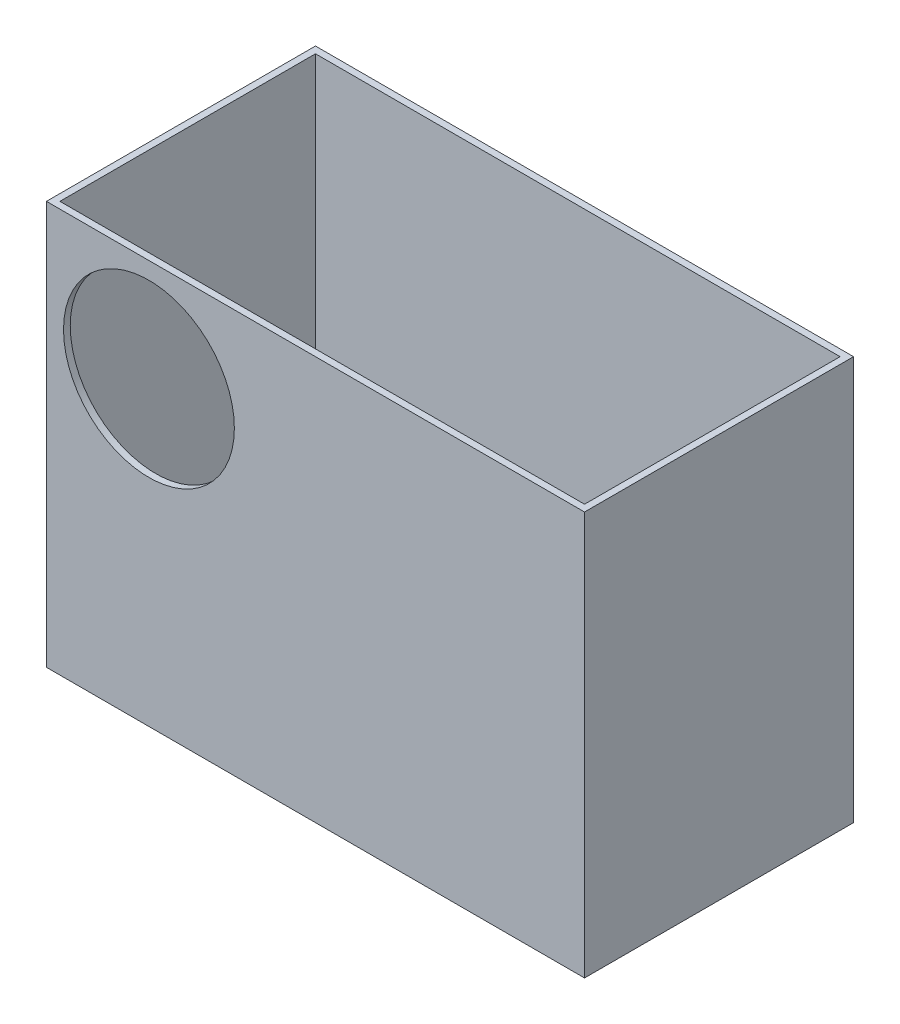
ISO-10303-21;
HEADER;
FILE_DESCRIPTION(('STEP AP214'),'2;1');
FILE_NAME('part.step','',(''),(''),'','','');
FILE_SCHEMA(('AUTOMOTIVE_DESIGN { 1 0 10303 214 1 1 1 1 }'));
ENDSEC;
DATA;
#1=APPLICATION_CONTEXT('core data for automotive mechanical design processes');
#2=APPLICATION_PROTOCOL_DEFINITION('international standard','automotive_design',2000,#1);
#3=PRODUCT_CONTEXT('',#1,'mechanical');
#4=PRODUCT('Part','Part','',(#3));
#5=PRODUCT_RELATED_PRODUCT_CATEGORY('part','',(#4));
#6=PRODUCT_DEFINITION_FORMATION('','',#4);
#7=PRODUCT_DEFINITION_CONTEXT('part definition',#1,'design');
#8=PRODUCT_DEFINITION('design','',#6,#7);
#9=PRODUCT_DEFINITION_SHAPE('','',#8);
#10=(LENGTH_UNIT() NAMED_UNIT(*) SI_UNIT(.MILLI.,.METRE.));
#11=(NAMED_UNIT(*) PLANE_ANGLE_UNIT() SI_UNIT($,.RADIAN.));
#12=(NAMED_UNIT(*) SI_UNIT($,.STERADIAN.) SOLID_ANGLE_UNIT());
#13=UNCERTAINTY_MEASURE_WITH_UNIT(LENGTH_MEASURE(1.E-05),#10,'distance_accuracy_value','');
#14=(GEOMETRIC_REPRESENTATION_CONTEXT(3) GLOBAL_UNCERTAINTY_ASSIGNED_CONTEXT((#13)) GLOBAL_UNIT_ASSIGNED_CONTEXT((#10,
#11,#12)) REPRESENTATION_CONTEXT('',''));
#15=CARTESIAN_POINT('',(0.,0.,0.));
#16=DIRECTION('',(0.,0.,1.));
#17=DIRECTION('',(1.,0.,0.));
#18=AXIS2_PLACEMENT_3D('',#15,#16,#17);
#19=CARTESIAN_POINT('',(0.,300.,0.));
#20=DIRECTION('',(0.,-1.,0.));
#21=DIRECTION('',(0.,0.,-1.));
#22=AXIS2_PLACEMENT_3D('',#19,#20,#21);
#23=PLANE('',#22);
#24=DIRECTION('',(0.,0.,-1.));
#25=VECTOR('',#24,1.);
#26=CARTESIAN_POINT('',(200.000000000001,300.,99.9999999999999));
#27=LINE('',#26,#25);
#28=CARTESIAN_POINT('',(200.000000000001,300.,99.9999999999999));
#29=VERTEX_POINT('',#28);
#30=CARTESIAN_POINT('',(200.000000000001,300.,-100.));
#31=VERTEX_POINT('',#30);
#32=EDGE_CURVE('E146',#29,#31,#27,.T.);
#33=ORIENTED_EDGE('',*,*,#32,.T.);
#34=DIRECTION('',(-1.,0.,0.));
#35=VECTOR('',#34,1.);
#36=CARTESIAN_POINT('',(-199.999999999999,300.,-100.));
#37=LINE('',#36,#35);
#38=CARTESIAN_POINT('',(-199.999999999999,300.,-100.));
#39=VERTEX_POINT('',#38);
#40=EDGE_CURVE('E149',#31,#39,#37,.T.);
#41=ORIENTED_EDGE('',*,*,#40,.T.);
#42=DIRECTION('',(0.,0.,1.));
#43=VECTOR('',#42,1.);
#44=CARTESIAN_POINT('',(-199.999999999999,300.,99.9999999999999));
#45=LINE('',#44,#43);
#46=CARTESIAN_POINT('',(-199.999999999999,300.,99.9999999999999));
#47=VERTEX_POINT('',#46);
#48=EDGE_CURVE('E152',#39,#47,#45,.T.);
#49=ORIENTED_EDGE('',*,*,#48,.T.);
#50=DIRECTION('',(1.,0.,0.));
#51=VECTOR('',#50,1.);
#52=CARTESIAN_POINT('',(-199.999999999999,300.,99.9999999999999));
#53=LINE('',#52,#51);
#54=EDGE_CURVE('E154',#47,#29,#53,.T.);
#55=ORIENTED_EDGE('',*,*,#54,.T.);
#56=EDGE_LOOP('',(#33,#41,#49,#55));
#57=FACE_BOUND('',#56,.T.);
#58=DIRECTION('',(0.,0.,-1.));
#59=VECTOR('',#58,1.);
#60=CARTESIAN_POINT('',(195.,300.,94.9999999999999));
#61=LINE('',#60,#59);
#62=CARTESIAN_POINT('',(195.,300.,94.9999999999999));
#63=VERTEX_POINT('',#62);
#64=CARTESIAN_POINT('',(195.,300.,-94.9999999999999));
#65=VERTEX_POINT('',#64);
#66=EDGE_CURVE('E131',#63,#65,#61,.T.);
#67=ORIENTED_EDGE('',*,*,#66,.F.);
#68=DIRECTION('',(1.,0.,0.));
#69=VECTOR('',#68,1.);
#70=CARTESIAN_POINT('',(-195.,300.,94.9999999999999));
#71=LINE('',#70,#69);
#72=CARTESIAN_POINT('',(-195.,300.,94.9999999999999));
#73=VERTEX_POINT('',#72);
#74=EDGE_CURVE('E112',#73,#63,#71,.T.);
#75=ORIENTED_EDGE('',*,*,#74,.F.);
#76=DIRECTION('',(0.,0.,1.));
#77=VECTOR('',#76,1.);
#78=CARTESIAN_POINT('',(-195.,300.,94.9999999999999));
#79=LINE('',#78,#77);
#80=CARTESIAN_POINT('',(-195.,300.,-94.9999999999999));
#81=VERTEX_POINT('',#80);
#82=EDGE_CURVE('E137',#81,#73,#79,.T.);
#83=ORIENTED_EDGE('',*,*,#82,.F.);
#84=DIRECTION('',(-1.,0.,0.));
#85=VECTOR('',#84,1.);
#86=CARTESIAN_POINT('',(-195.,300.,-94.9999999999999));
#87=LINE('',#86,#85);
#88=EDGE_CURVE('E135',#65,#81,#87,.T.);
#89=ORIENTED_EDGE('',*,*,#88,.F.);
#90=EDGE_LOOP('',(#67,#75,#83,#89));
#91=FACE_BOUND('',#90,.T.);
#92=ADVANCED_FACE('F40',(#57,#91),#23,.F.);
#93=CARTESIAN_POINT('',(0.,0.,0.));
#94=DIRECTION('',(0.,-1.,0.));
#95=DIRECTION('',(0.,0.,-1.));
#96=AXIS2_PLACEMENT_3D('',#93,#94,#95);
#97=PLANE('',#96);
#98=DIRECTION('',(0.,0.,-1.));
#99=VECTOR('',#98,1.);
#100=CARTESIAN_POINT('',(200.000000000001,0.,99.9999999999999));
#101=LINE('',#100,#99);
#102=CARTESIAN_POINT('',(200.000000000001,0.,99.9999999999999));
#103=VERTEX_POINT('',#102);
#104=CARTESIAN_POINT('',(200.000000000001,0.,-100.));
#105=VERTEX_POINT('',#104);
#106=EDGE_CURVE('E145',#103,#105,#101,.T.);
#107=ORIENTED_EDGE('',*,*,#106,.F.);
#108=DIRECTION('',(1.,0.,0.));
#109=VECTOR('',#108,1.);
#110=CARTESIAN_POINT('',(-199.999999999999,0.,99.9999999999999));
#111=LINE('',#110,#109);
#112=CARTESIAN_POINT('',(-199.999999999999,0.,99.9999999999999));
#113=VERTEX_POINT('',#112);
#114=EDGE_CURVE('E150',#113,#103,#111,.T.);
#115=ORIENTED_EDGE('',*,*,#114,.F.);
#116=DIRECTION('',(0.,0.,1.));
#117=VECTOR('',#116,1.);
#118=CARTESIAN_POINT('',(-199.999999999999,0.,99.9999999999999));
#119=LINE('',#118,#117);
#120=CARTESIAN_POINT('',(-199.999999999999,0.,-100.));
#121=VERTEX_POINT('',#120);
#122=EDGE_CURVE('E162',#121,#113,#119,.T.);
#123=ORIENTED_EDGE('',*,*,#122,.F.);
#124=DIRECTION('',(-1.,0.,0.));
#125=VECTOR('',#124,1.);
#126=CARTESIAN_POINT('',(-199.999999999999,0.,-100.));
#127=LINE('',#126,#125);
#128=EDGE_CURVE('E159',#105,#121,#127,.T.);
#129=ORIENTED_EDGE('',*,*,#128,.F.);
#130=EDGE_LOOP('',(#107,#115,#123,#129));
#131=FACE_BOUND('',#130,.T.);
#132=ADVANCED_FACE('F181',(#131),#97,.T.);
#133=CARTESIAN_POINT('',(200.000000000001,300.,99.9999999999999));
#134=DIRECTION('',(-1.,0.,0.));
#135=DIRECTION('',(0.,0.,1.));
#136=AXIS2_PLACEMENT_3D('',#133,#134,#135);
#137=PLANE('',#136);
#138=DIRECTION('',(0.,-1.,0.));
#139=VECTOR('',#138,1.);
#140=CARTESIAN_POINT('',(200.000000000001,300.,99.9999999999999));
#141=LINE('',#140,#139);
#142=EDGE_CURVE('E156',#29,#103,#141,.T.);
#143=ORIENTED_EDGE('',*,*,#142,.T.);
#144=ORIENTED_EDGE('',*,*,#106,.T.);
#145=DIRECTION('',(0.,-1.,0.));
#146=VECTOR('',#145,1.);
#147=CARTESIAN_POINT('',(200.000000000001,300.,-100.));
#148=LINE('',#147,#146);
#149=EDGE_CURVE('E48',#31,#105,#148,.T.);
#150=ORIENTED_EDGE('',*,*,#149,.F.);
#151=ORIENTED_EDGE('',*,*,#32,.F.);
#152=EDGE_LOOP('',(#143,#144,#150,#151));
#153=FACE_BOUND('',#152,.T.);
#154=ADVANCED_FACE('F42',(#153),#137,.F.);
#155=CARTESIAN_POINT('',(-199.999999999999,300.,-100.));
#156=DIRECTION('',(0.,0.,1.));
#157=DIRECTION('',(1.,0.,0.));
#158=AXIS2_PLACEMENT_3D('',#155,#156,#157);
#159=PLANE('',#158);
#160=ORIENTED_EDGE('',*,*,#149,.T.);
#161=ORIENTED_EDGE('',*,*,#128,.T.);
#162=DIRECTION('',(0.,-1.,0.));
#163=VECTOR('',#162,1.);
#164=CARTESIAN_POINT('',(-199.999999999999,300.,-100.));
#165=LINE('',#164,#163);
#166=EDGE_CURVE('E170',#39,#121,#165,.T.);
#167=ORIENTED_EDGE('',*,*,#166,.F.);
#168=ORIENTED_EDGE('',*,*,#40,.F.);
#169=EDGE_LOOP('',(#160,#161,#167,#168));
#170=FACE_BOUND('',#169,.T.);
#171=ADVANCED_FACE('F174',(#170),#159,.F.);
#172=CARTESIAN_POINT('',(-199.999999999999,300.,99.9999999999999));
#173=DIRECTION('',(1.,0.,0.));
#174=DIRECTION('',(0.,0.,-1.));
#175=AXIS2_PLACEMENT_3D('',#172,#173,#174);
#176=PLANE('',#175);
#177=ORIENTED_EDGE('',*,*,#166,.T.);
#178=ORIENTED_EDGE('',*,*,#122,.T.);
#179=DIRECTION('',(0.,-1.,0.));
#180=VECTOR('',#179,1.);
#181=CARTESIAN_POINT('',(-199.999999999999,300.,99.9999999999999));
#182=LINE('',#181,#180);
#183=EDGE_CURVE('E168',#47,#113,#182,.T.);
#184=ORIENTED_EDGE('',*,*,#183,.F.);
#185=ORIENTED_EDGE('',*,*,#48,.F.);
#186=EDGE_LOOP('',(#177,#178,#184,#185));
#187=FACE_BOUND('',#186,.T.);
#188=ADVANCED_FACE('F190',(#187),#176,.F.);
#189=CARTESIAN_POINT('',(-199.999999999999,300.,99.9999999999999));
#190=DIRECTION('',(0.,0.,-1.));
#191=DIRECTION('',(-1.,0.,0.));
#192=AXIS2_PLACEMENT_3D('',#189,#190,#191);
#193=PLANE('',#192);
#194=CARTESIAN_POINT('',(-123.799999999999,223.8,99.9999999999999));
#195=DIRECTION('',(0.,0.,1.));
#196=DIRECTION('',(1.,0.,0.));
#197=AXIS2_PLACEMENT_3D('',#194,#195,#196);
#198=CIRCLE('',#197,63.5);
#199=CARTESIAN_POINT('',(-60.2999999999988,223.8,99.9999999999999));
#200=VERTEX_POINT('',#199);
#201=EDGE_CURVE('E128',#200,#200,#198,.T.);
#202=ORIENTED_EDGE('',*,*,#201,.F.);
#203=EDGE_LOOP('',(#202));
#204=FACE_BOUND('',#203,.T.);
#205=ORIENTED_EDGE('',*,*,#183,.T.);
#206=ORIENTED_EDGE('',*,*,#114,.T.);
#207=ORIENTED_EDGE('',*,*,#142,.F.);
#208=ORIENTED_EDGE('',*,*,#54,.F.);
#209=EDGE_LOOP('',(#205,#206,#207,#208));
#210=FACE_BOUND('',#209,.T.);
#211=ADVANCED_FACE('F186',(#204,#210),#193,.F.);
#212=CARTESIAN_POINT('',(195.,300.,94.9999999999999));
#213=DIRECTION('',(-1.,0.,0.));
#214=DIRECTION('',(0.,0.,1.));
#215=AXIS2_PLACEMENT_3D('',#212,#213,#214);
#216=PLANE('',#215);
#217=DIRECTION('',(0.,0.,-1.));
#218=VECTOR('',#217,1.);
#219=CARTESIAN_POINT('',(195.,0.5,94.9999999999999));
#220=LINE('',#219,#218);
#221=CARTESIAN_POINT('',(195.,0.5,94.9999999999999));
#222=VERTEX_POINT('',#221);
#223=CARTESIAN_POINT('',(195.,0.5,-94.9999999999999));
#224=VERTEX_POINT('',#223);
#225=EDGE_CURVE('E118',#222,#224,#220,.T.);
#226=ORIENTED_EDGE('',*,*,#225,.F.);
#227=DIRECTION('',(0.,-1.,0.));
#228=VECTOR('',#227,1.);
#229=CARTESIAN_POINT('',(195.,300.,94.9999999999999));
#230=LINE('',#229,#228);
#231=EDGE_CURVE('E107',#63,#222,#230,.T.);
#232=ORIENTED_EDGE('',*,*,#231,.F.);
#233=ORIENTED_EDGE('',*,*,#66,.T.);
#234=DIRECTION('',(0.,-1.,0.));
#235=VECTOR('',#234,1.);
#236=CARTESIAN_POINT('',(195.,300.,-94.9999999999999));
#237=LINE('',#236,#235);
#238=EDGE_CURVE('E120',#65,#224,#237,.T.);
#239=ORIENTED_EDGE('',*,*,#238,.T.);
#240=EDGE_LOOP('',(#226,#232,#233,#239));
#241=FACE_BOUND('',#240,.T.);
#242=ADVANCED_FACE('F119',(#241),#216,.T.);
#243=CARTESIAN_POINT('',(-195.,300.,-94.9999999999999));
#244=DIRECTION('',(0.,0.,1.));
#245=DIRECTION('',(1.,0.,0.));
#246=AXIS2_PLACEMENT_3D('',#243,#244,#245);
#247=PLANE('',#246);
#248=DIRECTION('',(-1.,0.,0.));
#249=VECTOR('',#248,1.);
#250=CARTESIAN_POINT('',(-195.,0.5,-94.9999999999999));
#251=LINE('',#250,#249);
#252=CARTESIAN_POINT('',(-195.,0.5,-94.9999999999999));
#253=VERTEX_POINT('',#252);
#254=EDGE_CURVE('E55',#224,#253,#251,.T.);
#255=ORIENTED_EDGE('',*,*,#254,.F.);
#256=ORIENTED_EDGE('',*,*,#238,.F.);
#257=ORIENTED_EDGE('',*,*,#88,.T.);
#258=DIRECTION('',(0.,-1.,0.));
#259=VECTOR('',#258,1.);
#260=CARTESIAN_POINT('',(-195.,300.,-94.9999999999999));
#261=LINE('',#260,#259);
#262=EDGE_CURVE('E142',#81,#253,#261,.T.);
#263=ORIENTED_EDGE('',*,*,#262,.T.);
#264=EDGE_LOOP('',(#255,#256,#257,#263));
#265=FACE_BOUND('',#264,.T.);
#266=ADVANCED_FACE('F197',(#265),#247,.T.);
#267=CARTESIAN_POINT('',(-195.,300.,94.9999999999999));
#268=DIRECTION('',(1.,0.,0.));
#269=DIRECTION('',(0.,0.,-1.));
#270=AXIS2_PLACEMENT_3D('',#267,#268,#269);
#271=PLANE('',#270);
#272=DIRECTION('',(0.,0.,1.));
#273=VECTOR('',#272,1.);
#274=CARTESIAN_POINT('',(-195.,0.5,94.9999999999999));
#275=LINE('',#274,#273);
#276=CARTESIAN_POINT('',(-195.,0.5,94.9999999999999));
#277=VERTEX_POINT('',#276);
#278=EDGE_CURVE('E63',#253,#277,#275,.T.);
#279=ORIENTED_EDGE('',*,*,#278,.F.);
#280=ORIENTED_EDGE('',*,*,#262,.F.);
#281=ORIENTED_EDGE('',*,*,#82,.T.);
#282=DIRECTION('',(0.,-1.,0.));
#283=VECTOR('',#282,1.);
#284=CARTESIAN_POINT('',(-195.,300.,94.9999999999999));
#285=LINE('',#284,#283);
#286=EDGE_CURVE('E115',#73,#277,#285,.T.);
#287=ORIENTED_EDGE('',*,*,#286,.T.);
#288=EDGE_LOOP('',(#279,#280,#281,#287));
#289=FACE_BOUND('',#288,.T.);
#290=ADVANCED_FACE('F198',(#289),#271,.T.);
#291=CARTESIAN_POINT('',(-195.,300.,94.9999999999999));
#292=DIRECTION('',(0.,0.,-1.));
#293=DIRECTION('',(-1.,0.,0.));
#294=AXIS2_PLACEMENT_3D('',#291,#292,#293);
#295=PLANE('',#294);
#296=DIRECTION('',(1.,0.,0.));
#297=VECTOR('',#296,1.);
#298=CARTESIAN_POINT('',(-195.,0.5,94.9999999999999));
#299=LINE('',#298,#297);
#300=EDGE_CURVE('E11',#277,#222,#299,.T.);
#301=ORIENTED_EDGE('',*,*,#300,.F.);
#302=ORIENTED_EDGE('',*,*,#286,.F.);
#303=ORIENTED_EDGE('',*,*,#74,.T.);
#304=ORIENTED_EDGE('',*,*,#231,.T.);
#305=EDGE_LOOP('',(#301,#302,#303,#304));
#306=FACE_BOUND('',#305,.T.);
#307=CARTESIAN_POINT('',(-123.799999999999,223.8,94.9999999999999));
#308=DIRECTION('',(0.,0.,-1.));
#309=DIRECTION('',(-1.,0.,0.));
#310=AXIS2_PLACEMENT_3D('',#307,#308,#309);
#311=CIRCLE('',#310,63.5);
#312=CARTESIAN_POINT('',(-60.2999999999988,223.8,94.9999999999999));
#313=VERTEX_POINT('',#312);
#314=EDGE_CURVE('E122',#313,#313,#311,.F.);
#315=ORIENTED_EDGE('',*,*,#314,.T.);
#316=EDGE_LOOP('',(#315));
#317=FACE_BOUND('',#316,.T.);
#318=ADVANCED_FACE('F109',(#306,#317),#295,.T.);
#319=CARTESIAN_POINT('',(-123.799999999999,223.8,-100.001));
#320=DIRECTION('',(0.,0.,1.));
#321=DIRECTION('',(1.,0.,0.));
#322=AXIS2_PLACEMENT_3D('',#319,#320,#321);
#323=CYLINDRICAL_SURFACE('',#322,63.5);
#324=CARTESIAN_POINT('',(-60.2999999999988,223.8,94.9999999999999));
#325=CARTESIAN_POINT('',(-60.2999999999988,223.8,95.0520833333332));
#326=CARTESIAN_POINT('',(-60.2999999999988,223.8,95.1041666666666));
#327=CARTESIAN_POINT('',(-60.2999999999988,223.8,95.2083333333332));
#328=CARTESIAN_POINT('',(-60.2999999999988,223.8,95.2604166666666));
#329=CARTESIAN_POINT('',(-60.2999999999988,223.8,95.3645833333332));
#330=CARTESIAN_POINT('',(-60.2999999999988,223.8,95.4166666666666));
#331=CARTESIAN_POINT('',(-60.2999999999988,223.8,95.5208333333332));
#332=CARTESIAN_POINT('',(-60.2999999999988,223.8,95.5729166666666));
#333=CARTESIAN_POINT('',(-60.2999999999988,223.8,95.6770833333332));
#334=CARTESIAN_POINT('',(-60.2999999999988,223.8,95.7291666666666));
#335=CARTESIAN_POINT('',(-60.2999999999988,223.8,95.8333333333332));
#336=CARTESIAN_POINT('',(-60.2999999999988,223.8,95.8854166666666));
#337=CARTESIAN_POINT('',(-60.2999999999988,223.8,95.9895833333332));
#338=CARTESIAN_POINT('',(-60.2999999999988,223.8,96.0416666666666));
#339=CARTESIAN_POINT('',(-60.2999999999988,223.8,96.1458333333332));
#340=CARTESIAN_POINT('',(-60.2999999999988,223.8,96.1979166666666));
#341=CARTESIAN_POINT('',(-60.2999999999988,223.8,96.3020833333332));
#342=CARTESIAN_POINT('',(-60.2999999999988,223.8,96.3541666666666));
#343=CARTESIAN_POINT('',(-60.2999999999988,223.8,96.4583333333332));
#344=CARTESIAN_POINT('',(-60.2999999999988,223.8,96.5104166666666));
#345=CARTESIAN_POINT('',(-60.2999999999988,223.8,96.6145833333332));
#346=CARTESIAN_POINT('',(-60.2999999999988,223.8,96.6666666666666));
#347=CARTESIAN_POINT('',(-60.2999999999988,223.8,96.7708333333332));
#348=CARTESIAN_POINT('',(-60.2999999999988,223.8,96.8229166666666));
#349=CARTESIAN_POINT('',(-60.2999999999988,223.8,96.9270833333332));
#350=CARTESIAN_POINT('',(-60.2999999999988,223.8,96.9791666666666));
#351=CARTESIAN_POINT('',(-60.2999999999988,223.8,97.0833333333332));
#352=CARTESIAN_POINT('',(-60.2999999999988,223.8,97.1354166666666));
#353=CARTESIAN_POINT('',(-60.2999999999988,223.8,97.2395833333333));
#354=CARTESIAN_POINT('',(-60.2999999999988,223.8,97.2916666666666));
#355=CARTESIAN_POINT('',(-60.2999999999988,223.8,97.3958333333333));
#356=CARTESIAN_POINT('',(-60.2999999999988,223.8,97.4479166666666));
#357=CARTESIAN_POINT('',(-60.2999999999988,223.8,97.5520833333332));
#358=CARTESIAN_POINT('',(-60.2999999999988,223.8,97.6041666666666));
#359=CARTESIAN_POINT('',(-60.2999999999988,223.8,97.7083333333332));
#360=CARTESIAN_POINT('',(-60.2999999999988,223.8,97.7604166666666));
#361=CARTESIAN_POINT('',(-60.2999999999988,223.8,97.8645833333333));
#362=CARTESIAN_POINT('',(-60.2999999999988,223.8,97.9166666666666));
#363=CARTESIAN_POINT('',(-60.2999999999988,223.8,98.0208333333333));
#364=CARTESIAN_POINT('',(-60.2999999999988,223.8,98.0729166666666));
#365=CARTESIAN_POINT('',(-60.2999999999988,223.8,98.1770833333333));
#366=CARTESIAN_POINT('',(-60.2999999999988,223.8,98.2291666666666));
#367=CARTESIAN_POINT('',(-60.2999999999988,223.8,98.3333333333333));
#368=CARTESIAN_POINT('',(-60.2999999999988,223.8,98.3854166666666));
#369=CARTESIAN_POINT('',(-60.2999999999988,223.8,98.4895833333333));
#370=CARTESIAN_POINT('',(-60.2999999999988,223.8,98.5416666666666));
#371=CARTESIAN_POINT('',(-60.2999999999988,223.8,98.6458333333333));
#372=CARTESIAN_POINT('',(-60.2999999999988,223.8,98.6979166666666));
#373=CARTESIAN_POINT('',(-60.2999999999988,223.8,98.8020833333333));
#374=CARTESIAN_POINT('',(-60.2999999999988,223.8,98.8541666666666));
#375=CARTESIAN_POINT('',(-60.2999999999988,223.8,98.9583333333333));
#376=CARTESIAN_POINT('',(-60.2999999999988,223.8,99.0104166666666));
#377=CARTESIAN_POINT('',(-60.2999999999988,223.8,99.1145833333333));
#378=CARTESIAN_POINT('',(-60.2999999999988,223.8,99.1666666666666));
#379=CARTESIAN_POINT('',(-60.2999999999988,223.8,99.2708333333333));
#380=CARTESIAN_POINT('',(-60.2999999999988,223.8,99.3229166666666));
#381=CARTESIAN_POINT('',(-60.2999999999988,223.8,99.4270833333333));
#382=CARTESIAN_POINT('',(-60.2999999999988,223.8,99.4791666666666));
#383=CARTESIAN_POINT('',(-60.2999999999988,223.8,99.5833333333333));
#384=CARTESIAN_POINT('',(-60.2999999999988,223.8,99.6354166666666));
#385=CARTESIAN_POINT('',(-60.2999999999988,223.8,99.7395833333333));
#386=CARTESIAN_POINT('',(-60.2999999999988,223.8,99.7916666666666));
#387=CARTESIAN_POINT('',(-60.2999999999988,223.8,99.8958333333333));
#388=CARTESIAN_POINT('',(-60.2999999999988,223.8,99.9479166666666));
#389=CARTESIAN_POINT('',(-60.2999999999988,223.8,99.9999999999999));
#390=B_SPLINE_CURVE_WITH_KNOTS('',3,(#324,#325,#326,#327,#328,#329,#330,#331,#332,#333,#334,
#335,#336,#337,#338,#339,#340,#341,#342,#343,#344,#345,#346,#347,#348,#349,#350,#351,#352,#353,
#354,#355,#356,#357,#358,#359,#360,#361,#362,#363,#364,#365,#366,#367,#368,#369,#370,#371,#372,
#373,#374,#375,#376,#377,#378,#379,#380,#381,#382,#383,#384,#385,#386,#387,#388,#389),
.UNSPECIFIED.,.F.,.F.,(4,2,2,2,2,2,2,2,2,2,2,2,2,2,2,2,2,2,2,2,2,2,2,2,2,2,2,2,2,2,2,2,4),(0.,
0.156249999999997,0.312499999999993,0.468750000000018,0.625000000000014,0.781250000000011,
0.937500000000008,1.09375,1.25000000000003,1.40625000000003,1.56250000000002,1.71875000000002,
1.87500000000002,2.03125000000001,2.18750000000004,2.34375000000003,2.50000000000003,
2.65625000000003,2.81250000000002,2.96875000000005,3.12500000000004,3.28125000000004,
3.43750000000004,3.59375000000003,3.75000000000003,3.90625000000006,4.06250000000005,
4.21875000000005,4.37500000000005,4.53125000000004,4.68750000000007,4.84375000000006,
5.00000000000006),.UNSPECIFIED.);
#391=EDGE_CURVE('BSEAM205',#313,#200,#390,.T.);
#392=ORIENTED_EDGE('',*,*,#314,.F.);
#393=ORIENTED_EDGE('',*,*,#201,.T.);
#394=ORIENTED_EDGE('',*,*,#391,.T.);
#395=ORIENTED_EDGE('',*,*,#391,.F.);
#396=EDGE_LOOP('',(#392,#394,#393,#395));
#397=FACE_BOUND('',#396,.T.);
#398=ADVANCED_FACE('F205',(#397),#323,.F.);
#399=CARTESIAN_POINT('',(0.,0.5,0.));
#400=DIRECTION('',(0.,1.,0.));
#401=DIRECTION('',(0.,0.,1.));
#402=AXIS2_PLACEMENT_3D('',#399,#400,#401);
#403=PLANE('',#402);
#404=ORIENTED_EDGE('',*,*,#300,.T.);
#405=ORIENTED_EDGE('',*,*,#225,.T.);
#406=ORIENTED_EDGE('',*,*,#254,.T.);
#407=ORIENTED_EDGE('',*,*,#278,.T.);
#408=EDGE_LOOP('',(#404,#405,#406,#407));
#409=FACE_BOUND('',#408,.T.);
#410=ADVANCED_FACE('F124',(#409),#403,.T.);
#411=CLOSED_SHELL('',(#92,#132,#154,#171,#188,#211,#242,#266,#290,#318,#398,#410));
#412=MANIFOLD_SOLID_BREP('B2',#411);
#413=ADVANCED_BREP_SHAPE_REPRESENTATION('',(#18,#412),#14);
#414=SHAPE_DEFINITION_REPRESENTATION(#9,#413);
ENDSEC;
END-ISO-10303-21;
